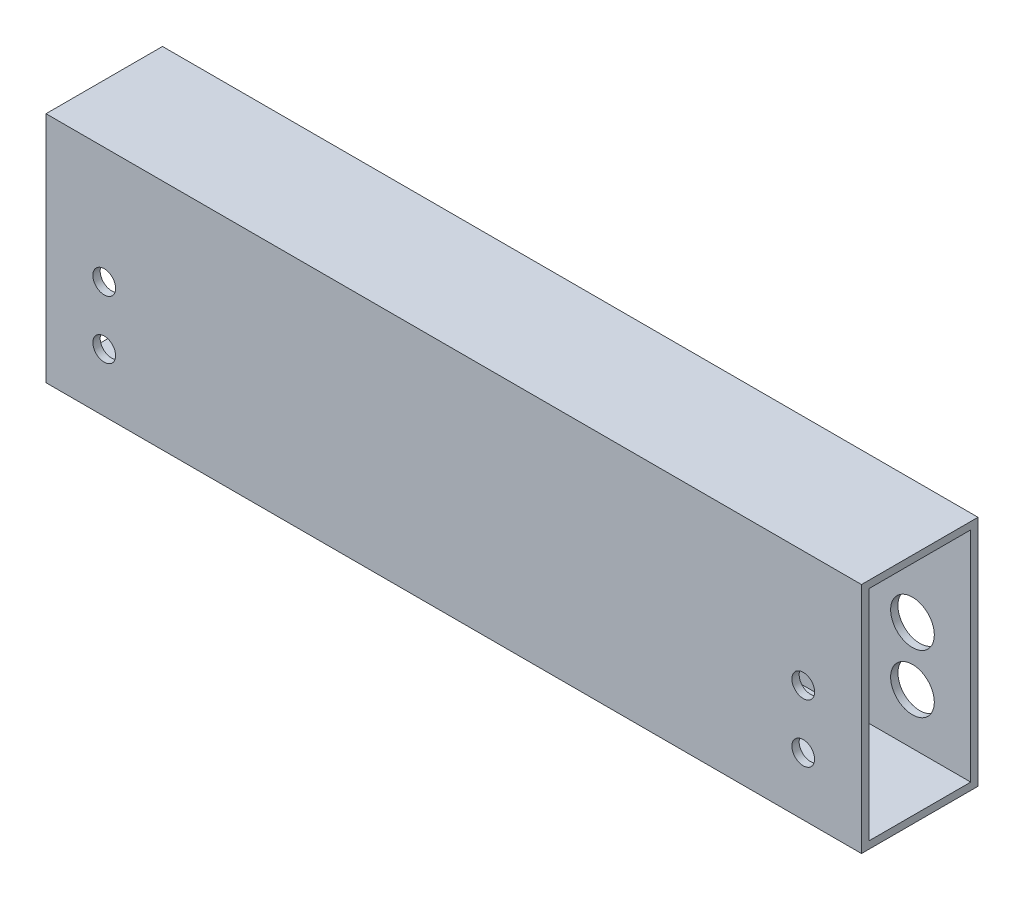
ISO-10303-21;
HEADER;
FILE_DESCRIPTION(('STEP AP214'),'2;1');
FILE_NAME('part.step','',(''),(''),'','','');
FILE_SCHEMA(('AUTOMOTIVE_DESIGN { 1 0 10303 214 1 1 1 1 }'));
ENDSEC;
DATA;
#1=APPLICATION_CONTEXT('core data for automotive mechanical design processes');
#2=APPLICATION_PROTOCOL_DEFINITION('international standard','automotive_design',2000,#1);
#3=PRODUCT_CONTEXT('',#1,'mechanical');
#4=PRODUCT('Part','Part','',(#3));
#5=PRODUCT_RELATED_PRODUCT_CATEGORY('part','',(#4));
#6=PRODUCT_DEFINITION_FORMATION('','',#4);
#7=PRODUCT_DEFINITION_CONTEXT('part definition',#1,'design');
#8=PRODUCT_DEFINITION('design','',#6,#7);
#9=PRODUCT_DEFINITION_SHAPE('','',#8);
#10=(LENGTH_UNIT() NAMED_UNIT(*) SI_UNIT(.MILLI.,.METRE.));
#11=(NAMED_UNIT(*) PLANE_ANGLE_UNIT() SI_UNIT($,.RADIAN.));
#12=(NAMED_UNIT(*) SI_UNIT($,.STERADIAN.) SOLID_ANGLE_UNIT());
#13=UNCERTAINTY_MEASURE_WITH_UNIT(LENGTH_MEASURE(1.E-05),#10,'distance_accuracy_value','');
#14=(GEOMETRIC_REPRESENTATION_CONTEXT(3) GLOBAL_UNCERTAINTY_ASSIGNED_CONTEXT((#13)) GLOBAL_UNIT_ASSIGNED_CONTEXT((#10,
#11,#12)) REPRESENTATION_CONTEXT('',''));
#15=CARTESIAN_POINT('',(0.,0.,0.));
#16=DIRECTION('',(0.,0.,1.));
#17=DIRECTION('',(1.,0.,0.));
#18=AXIS2_PLACEMENT_3D('',#15,#16,#17);
#19=CARTESIAN_POINT('',(177.8,838.2,-130.175));
#20=DIRECTION('',(0.,0.,1.));
#21=DIRECTION('',(1.,0.,0.));
#22=AXIS2_PLACEMENT_3D('',#19,#20,#21);
#23=PLANE('',#22);
#24=CARTESIAN_POINT('',(12.7,850.9,-130.175));
#25=DIRECTION('',(0.,0.,-1.));
#26=DIRECTION('',(-1.,0.,0.));
#27=AXIS2_PLACEMENT_3D('',#24,#25,#26);
#28=CIRCLE('',#27,4.76250000000007);
#29=CARTESIAN_POINT('',(7.93749999999992,850.9,-130.175));
#30=VERTEX_POINT('',#29);
#31=EDGE_CURVE('E191',#30,#30,#28,.T.);
#32=ORIENTED_EDGE('',*,*,#31,.F.);
#33=EDGE_LOOP('',(#32));
#34=FACE_BOUND('',#33,.T.);
#35=CARTESIAN_POINT('',(165.1,863.6,-130.175));
#36=DIRECTION('',(0.,0.,-1.));
#37=DIRECTION('',(-1.,0.,0.));
#38=AXIS2_PLACEMENT_3D('',#35,#36,#37);
#39=CIRCLE('',#38,4.76250000000008);
#40=CARTESIAN_POINT('',(160.3375,863.6,-130.175));
#41=VERTEX_POINT('',#40);
#42=EDGE_CURVE('E192',#41,#41,#39,.T.);
#43=ORIENTED_EDGE('',*,*,#42,.F.);
#44=EDGE_LOOP('',(#43));
#45=FACE_BOUND('',#44,.T.);
#46=CARTESIAN_POINT('',(165.1,850.9,-130.175));
#47=DIRECTION('',(0.,0.,-1.));
#48=DIRECTION('',(-1.,0.,0.));
#49=AXIS2_PLACEMENT_3D('',#46,#47,#48);
#50=CIRCLE('',#49,4.76250000000008);
#51=CARTESIAN_POINT('',(160.3375,850.9,-130.175));
#52=VERTEX_POINT('',#51);
#53=EDGE_CURVE('E178',#52,#52,#50,.T.);
#54=ORIENTED_EDGE('',*,*,#53,.F.);
#55=EDGE_LOOP('',(#54));
#56=FACE_BOUND('',#55,.T.);
#57=CARTESIAN_POINT('',(12.7,863.6,-130.175));
#58=DIRECTION('',(0.,0.,-1.));
#59=DIRECTION('',(-1.,0.,0.));
#60=AXIS2_PLACEMENT_3D('',#57,#58,#59);
#61=CIRCLE('',#60,4.76250000000009);
#62=CARTESIAN_POINT('',(7.93749999999991,863.6,-130.175));
#63=VERTEX_POINT('',#62);
#64=EDGE_CURVE('E195',#63,#63,#61,.T.);
#65=ORIENTED_EDGE('',*,*,#64,.F.);
#66=EDGE_LOOP('',(#65));
#67=FACE_BOUND('',#66,.T.);
#68=DIRECTION('',(0.,1.,0.));
#69=VECTOR('',#68,1.);
#70=CARTESIAN_POINT('',(0.,838.2,-130.175));
#71=LINE('',#70,#69);
#72=CARTESIAN_POINT('',(0.,838.2,-130.175));
#73=VERTEX_POINT('',#72);
#74=CARTESIAN_POINT('',(0.,889.,-130.175));
#75=VERTEX_POINT('',#74);
#76=EDGE_CURVE('E148',#73,#75,#71,.T.);
#77=ORIENTED_EDGE('',*,*,#76,.T.);
#78=DIRECTION('',(-1.,0.,0.));
#79=VECTOR('',#78,1.);
#80=CARTESIAN_POINT('',(177.8,889.,-130.175));
#81=LINE('',#80,#79);
#82=CARTESIAN_POINT('',(177.8,889.,-130.175));
#83=VERTEX_POINT('',#82);
#84=EDGE_CURVE('E11',#83,#75,#81,.T.);
#85=ORIENTED_EDGE('',*,*,#84,.F.);
#86=DIRECTION('',(0.,1.,0.));
#87=VECTOR('',#86,1.);
#88=CARTESIAN_POINT('',(177.8,838.2,-130.175));
#89=LINE('',#88,#87);
#90=CARTESIAN_POINT('',(177.8,838.2,-130.175));
#91=VERTEX_POINT('',#90);
#92=EDGE_CURVE('E137',#91,#83,#89,.T.);
#93=ORIENTED_EDGE('',*,*,#92,.F.);
#94=DIRECTION('',(-1.,0.,0.));
#95=VECTOR('',#94,1.);
#96=CARTESIAN_POINT('',(177.8,838.2,-130.175));
#97=LINE('',#96,#95);
#98=EDGE_CURVE('E147',#91,#73,#97,.T.);
#99=ORIENTED_EDGE('',*,*,#98,.T.);
#100=EDGE_LOOP('',(#77,#85,#93,#99));
#101=FACE_BOUND('',#100,.T.);
#102=ADVANCED_FACE('F37',(#34,#45,#56,#67,#101),#23,.F.);
#103=CARTESIAN_POINT('',(177.8,889.,-130.175));
#104=DIRECTION('',(0.,-1.,0.));
#105=DIRECTION('',(0.,0.,-1.));
#106=AXIS2_PLACEMENT_3D('',#103,#104,#105);
#107=PLANE('',#106);
#108=DIRECTION('',(0.,0.,1.));
#109=VECTOR('',#108,1.);
#110=CARTESIAN_POINT('',(0.,889.,-130.175));
#111=LINE('',#110,#109);
#112=CARTESIAN_POINT('',(0.,889.,-104.775));
#113=VERTEX_POINT('',#112);
#114=EDGE_CURVE('E151',#75,#113,#111,.T.);
#115=ORIENTED_EDGE('',*,*,#114,.T.);
#116=DIRECTION('',(-1.,0.,0.));
#117=VECTOR('',#116,1.);
#118=CARTESIAN_POINT('',(177.8,889.,-104.775));
#119=LINE('',#118,#117);
#120=CARTESIAN_POINT('',(177.8,889.,-104.775));
#121=VERTEX_POINT('',#120);
#122=EDGE_CURVE('E45',#121,#113,#119,.T.);
#123=ORIENTED_EDGE('',*,*,#122,.F.);
#124=DIRECTION('',(0.,0.,1.));
#125=VECTOR('',#124,1.);
#126=CARTESIAN_POINT('',(177.8,889.,-130.175));
#127=LINE('',#126,#125);
#128=EDGE_CURVE('E140',#83,#121,#127,.T.);
#129=ORIENTED_EDGE('',*,*,#128,.F.);
#130=ORIENTED_EDGE('',*,*,#84,.T.);
#131=EDGE_LOOP('',(#115,#123,#129,#130));
#132=FACE_BOUND('',#131,.T.);
#133=ADVANCED_FACE('F225',(#132),#107,.F.);
#134=CARTESIAN_POINT('',(177.8,838.2,-104.775));
#135=DIRECTION('',(0.,0.,-1.));
#136=DIRECTION('',(-1.,0.,0.));
#137=AXIS2_PLACEMENT_3D('',#134,#135,#136);
#138=PLANE('',#137);
#139=CARTESIAN_POINT('',(165.1,850.9,-104.775));
#140=DIRECTION('',(0.,0.,-1.));
#141=DIRECTION('',(-1.,0.,0.));
#142=AXIS2_PLACEMENT_3D('',#139,#140,#141);
#143=CIRCLE('',#142,2.47649999999997);
#144=CARTESIAN_POINT('',(162.6235,850.9,-104.775));
#145=VERTEX_POINT('',#144);
#146=EDGE_CURVE('E314',#145,#145,#143,.F.);
#147=ORIENTED_EDGE('',*,*,#146,.F.);
#148=EDGE_LOOP('',(#147));
#149=FACE_BOUND('',#148,.T.);
#150=CARTESIAN_POINT('',(12.7,863.6,-104.775));
#151=DIRECTION('',(0.,0.,-1.));
#152=DIRECTION('',(-1.,0.,0.));
#153=AXIS2_PLACEMENT_3D('',#150,#151,#152);
#154=CIRCLE('',#153,2.47649999999999);
#155=CARTESIAN_POINT('',(10.2235,863.6,-104.775));
#156=VERTEX_POINT('',#155);
#157=EDGE_CURVE('E311',#156,#156,#154,.F.);
#158=ORIENTED_EDGE('',*,*,#157,.F.);
#159=EDGE_LOOP('',(#158));
#160=FACE_BOUND('',#159,.T.);
#161=CARTESIAN_POINT('',(12.7,850.9,-104.775));
#162=DIRECTION('',(0.,0.,-1.));
#163=DIRECTION('',(-1.,0.,0.));
#164=AXIS2_PLACEMENT_3D('',#161,#162,#163);
#165=CIRCLE('',#164,2.47649999999999);
#166=CARTESIAN_POINT('',(10.2235,850.9,-104.775));
#167=VERTEX_POINT('',#166);
#168=EDGE_CURVE('E309',#167,#167,#165,.F.);
#169=ORIENTED_EDGE('',*,*,#168,.F.);
#170=EDGE_LOOP('',(#169));
#171=FACE_BOUND('',#170,.T.);
#172=CARTESIAN_POINT('',(165.1,863.6,-104.775));
#173=DIRECTION('',(0.,0.,-1.));
#174=DIRECTION('',(-1.,0.,0.));
#175=AXIS2_PLACEMENT_3D('',#172,#173,#174);
#176=CIRCLE('',#175,2.47649999999997);
#177=CARTESIAN_POINT('',(162.6235,863.6,-104.775));
#178=VERTEX_POINT('',#177);
#179=EDGE_CURVE('E167',#178,#178,#176,.F.);
#180=ORIENTED_EDGE('',*,*,#179,.F.);
#181=EDGE_LOOP('',(#180));
#182=FACE_BOUND('',#181,.T.);
#183=DIRECTION('',(0.,-1.,0.));
#184=VECTOR('',#183,1.);
#185=CARTESIAN_POINT('',(0.,838.2,-104.775));
#186=LINE('',#185,#184);
#187=CARTESIAN_POINT('',(0.,838.2,-104.775));
#188=VERTEX_POINT('',#187);
#189=EDGE_CURVE('E153',#113,#188,#186,.T.);
#190=ORIENTED_EDGE('',*,*,#189,.T.);
#191=DIRECTION('',(-1.,0.,0.));
#192=VECTOR('',#191,1.);
#193=CARTESIAN_POINT('',(177.8,838.2,-104.775));
#194=LINE('',#193,#192);
#195=CARTESIAN_POINT('',(177.8,838.2,-104.775));
#196=VERTEX_POINT('',#195);
#197=EDGE_CURVE('E158',#196,#188,#194,.T.);
#198=ORIENTED_EDGE('',*,*,#197,.F.);
#199=DIRECTION('',(0.,-1.,0.));
#200=VECTOR('',#199,1.);
#201=CARTESIAN_POINT('',(177.8,838.2,-104.775));
#202=LINE('',#201,#200);
#203=EDGE_CURVE('E143',#121,#196,#202,.T.);
#204=ORIENTED_EDGE('',*,*,#203,.F.);
#205=ORIENTED_EDGE('',*,*,#122,.T.);
#206=EDGE_LOOP('',(#190,#198,#204,#205));
#207=FACE_BOUND('',#206,.T.);
#208=ADVANCED_FACE('F230',(#149,#160,#171,#182,#207),#138,.F.);
#209=CARTESIAN_POINT('',(177.8,838.2,-130.175));
#210=DIRECTION('',(0.,1.,0.));
#211=DIRECTION('',(0.,0.,1.));
#212=AXIS2_PLACEMENT_3D('',#209,#210,#211);
#213=PLANE('',#212);
#214=DIRECTION('',(0.,0.,-1.));
#215=VECTOR('',#214,1.);
#216=CARTESIAN_POINT('',(0.,838.2,-130.175));
#217=LINE('',#216,#215);
#218=EDGE_CURVE('E141',#188,#73,#217,.T.);
#219=ORIENTED_EDGE('',*,*,#218,.T.);
#220=ORIENTED_EDGE('',*,*,#98,.F.);
#221=DIRECTION('',(0.,0.,-1.));
#222=VECTOR('',#221,1.);
#223=CARTESIAN_POINT('',(177.8,838.2,-130.175));
#224=LINE('',#223,#222);
#225=EDGE_CURVE('E145',#196,#91,#224,.T.);
#226=ORIENTED_EDGE('',*,*,#225,.F.);
#227=ORIENTED_EDGE('',*,*,#197,.T.);
#228=EDGE_LOOP('',(#219,#220,#226,#227));
#229=FACE_BOUND('',#228,.T.);
#230=ADVANCED_FACE('F251',(#229),#213,.F.);
#231=CARTESIAN_POINT('',(177.8,0.,0.));
#232=DIRECTION('',(1.,0.,0.));
#233=DIRECTION('',(0.,0.,-1.));
#234=AXIS2_PLACEMENT_3D('',#231,#232,#233);
#235=PLANE('',#234);
#236=DIRECTION('',(0.,1.,0.));
#237=VECTOR('',#236,1.);
#238=CARTESIAN_POINT('',(177.8,838.2,-128.5875));
#239=LINE('',#238,#237);
#240=CARTESIAN_POINT('',(177.8,839.7875,-128.5875));
#241=VERTEX_POINT('',#240);
#242=CARTESIAN_POINT('',(177.8,887.4125,-128.5875));
#243=VERTEX_POINT('',#242);
#244=EDGE_CURVE('E125',#241,#243,#239,.T.);
#245=ORIENTED_EDGE('',*,*,#244,.F.);
#246=DIRECTION('',(0.,0.,-1.));
#247=VECTOR('',#246,1.);
#248=CARTESIAN_POINT('',(177.8,839.7875,-130.175));
#249=LINE('',#248,#247);
#250=CARTESIAN_POINT('',(177.8,839.7875,-106.3625));
#251=VERTEX_POINT('',#250);
#252=EDGE_CURVE('E108',#251,#241,#249,.T.);
#253=ORIENTED_EDGE('',*,*,#252,.F.);
#254=DIRECTION('',(0.,-1.,0.));
#255=VECTOR('',#254,1.);
#256=CARTESIAN_POINT('',(177.8,838.2,-106.3625));
#257=LINE('',#256,#255);
#258=CARTESIAN_POINT('',(177.8,887.4125,-106.3625));
#259=VERTEX_POINT('',#258);
#260=EDGE_CURVE('E134',#259,#251,#257,.T.);
#261=ORIENTED_EDGE('',*,*,#260,.F.);
#262=DIRECTION('',(0.,0.,1.));
#263=VECTOR('',#262,1.);
#264=CARTESIAN_POINT('',(177.8,887.4125,-130.175));
#265=LINE('',#264,#263);
#266=EDGE_CURVE('E127',#243,#259,#265,.T.);
#267=ORIENTED_EDGE('',*,*,#266,.F.);
#268=EDGE_LOOP('',(#245,#253,#261,#267));
#269=FACE_BOUND('',#268,.T.);
#270=ORIENTED_EDGE('',*,*,#92,.T.);
#271=ORIENTED_EDGE('',*,*,#128,.T.);
#272=ORIENTED_EDGE('',*,*,#203,.T.);
#273=ORIENTED_EDGE('',*,*,#225,.T.);
#274=EDGE_LOOP('',(#270,#271,#272,#273));
#275=FACE_BOUND('',#274,.T.);
#276=ADVANCED_FACE('F210',(#269,#275),#235,.T.);
#277=CARTESIAN_POINT('',(0.,0.,0.));
#278=DIRECTION('',(1.,0.,0.));
#279=DIRECTION('',(0.,0.,-1.));
#280=AXIS2_PLACEMENT_3D('',#277,#278,#279);
#281=PLANE('',#280);
#282=DIRECTION('',(0.,0.,-1.));
#283=VECTOR('',#282,1.);
#284=CARTESIAN_POINT('',(0.,839.7875,-130.175));
#285=LINE('',#284,#283);
#286=CARTESIAN_POINT('',(0.,839.7875,-106.3625));
#287=VERTEX_POINT('',#286);
#288=CARTESIAN_POINT('',(0.,839.7875,-128.5875));
#289=VERTEX_POINT('',#288);
#290=EDGE_CURVE('E106',#287,#289,#285,.T.);
#291=ORIENTED_EDGE('',*,*,#290,.T.);
#292=DIRECTION('',(0.,1.,0.));
#293=VECTOR('',#292,1.);
#294=CARTESIAN_POINT('',(0.,838.2,-128.5875));
#295=LINE('',#294,#293);
#296=CARTESIAN_POINT('',(0.,887.4125,-128.5875));
#297=VERTEX_POINT('',#296);
#298=EDGE_CURVE('E114',#289,#297,#295,.T.);
#299=ORIENTED_EDGE('',*,*,#298,.T.);
#300=DIRECTION('',(0.,0.,1.));
#301=VECTOR('',#300,1.);
#302=CARTESIAN_POINT('',(0.,887.4125,-130.175));
#303=LINE('',#302,#301);
#304=CARTESIAN_POINT('',(0.,887.4125,-106.3625));
#305=VERTEX_POINT('',#304);
#306=EDGE_CURVE('E120',#297,#305,#303,.T.);
#307=ORIENTED_EDGE('',*,*,#306,.T.);
#308=DIRECTION('',(0.,-1.,0.));
#309=VECTOR('',#308,1.);
#310=CARTESIAN_POINT('',(0.,838.2,-106.3625));
#311=LINE('',#310,#309);
#312=EDGE_CURVE('E60',#305,#287,#311,.T.);
#313=ORIENTED_EDGE('',*,*,#312,.T.);
#314=EDGE_LOOP('',(#291,#299,#307,#313));
#315=FACE_BOUND('',#314,.T.);
#316=ORIENTED_EDGE('',*,*,#76,.F.);
#317=ORIENTED_EDGE('',*,*,#218,.F.);
#318=ORIENTED_EDGE('',*,*,#189,.F.);
#319=ORIENTED_EDGE('',*,*,#114,.F.);
#320=EDGE_LOOP('',(#316,#317,#318,#319));
#321=FACE_BOUND('',#320,.T.);
#322=ADVANCED_FACE('F123',(#315,#321),#281,.F.);
#323=CARTESIAN_POINT('',(177.8,838.2,-128.5875));
#324=DIRECTION('',(0.,0.,1.));
#325=DIRECTION('',(1.,0.,0.));
#326=AXIS2_PLACEMENT_3D('',#323,#324,#325);
#327=PLANE('',#326);
#328=CARTESIAN_POINT('',(12.7,850.9,-128.5875));
#329=DIRECTION('',(0.,0.,1.));
#330=DIRECTION('',(1.,0.,0.));
#331=AXIS2_PLACEMENT_3D('',#328,#329,#330);
#332=CIRCLE('',#331,4.76250000000007);
#333=CARTESIAN_POINT('',(17.4625000000001,850.9,-128.5875));
#334=VERTEX_POINT('',#333);
#335=EDGE_CURVE('E188',#334,#334,#332,.F.);
#336=ORIENTED_EDGE('',*,*,#335,.T.);
#337=EDGE_LOOP('',(#336));
#338=FACE_BOUND('',#337,.T.);
#339=CARTESIAN_POINT('',(165.1,863.6,-128.5875));
#340=DIRECTION('',(0.,0.,1.));
#341=DIRECTION('',(1.,0.,0.));
#342=AXIS2_PLACEMENT_3D('',#339,#340,#341);
#343=CIRCLE('',#342,4.76250000000008);
#344=CARTESIAN_POINT('',(169.8625,863.6,-128.5875));
#345=VERTEX_POINT('',#344);
#346=EDGE_CURVE('E183',#345,#345,#343,.F.);
#347=ORIENTED_EDGE('',*,*,#346,.T.);
#348=EDGE_LOOP('',(#347));
#349=FACE_BOUND('',#348,.T.);
#350=CARTESIAN_POINT('',(165.1,850.9,-128.5875));
#351=DIRECTION('',(0.,0.,1.));
#352=DIRECTION('',(1.,0.,0.));
#353=AXIS2_PLACEMENT_3D('',#350,#351,#352);
#354=CIRCLE('',#353,4.76250000000008);
#355=CARTESIAN_POINT('',(169.8625,850.9,-128.5875));
#356=VERTEX_POINT('',#355);
#357=EDGE_CURVE('E174',#356,#356,#354,.F.);
#358=ORIENTED_EDGE('',*,*,#357,.T.);
#359=EDGE_LOOP('',(#358));
#360=FACE_BOUND('',#359,.T.);
#361=CARTESIAN_POINT('',(12.7,863.6,-128.5875));
#362=DIRECTION('',(0.,0.,1.));
#363=DIRECTION('',(1.,0.,0.));
#364=AXIS2_PLACEMENT_3D('',#361,#362,#363);
#365=CIRCLE('',#364,4.76250000000009);
#366=CARTESIAN_POINT('',(17.4625000000001,863.6,-128.5875));
#367=VERTEX_POINT('',#366);
#368=EDGE_CURVE('E121',#367,#367,#365,.F.);
#369=ORIENTED_EDGE('',*,*,#368,.T.);
#370=EDGE_LOOP('',(#369));
#371=FACE_BOUND('',#370,.T.);
#372=ORIENTED_EDGE('',*,*,#298,.F.);
#373=DIRECTION('',(-1.,0.,0.));
#374=VECTOR('',#373,1.);
#375=CARTESIAN_POINT('',(177.8,839.7875,-128.5875));
#376=LINE('',#375,#374);
#377=EDGE_CURVE('E102',#241,#289,#376,.T.);
#378=ORIENTED_EDGE('',*,*,#377,.F.);
#379=ORIENTED_EDGE('',*,*,#244,.T.);
#380=DIRECTION('',(-1.,0.,0.));
#381=VECTOR('',#380,1.);
#382=CARTESIAN_POINT('',(177.8,887.4125,-128.5875));
#383=LINE('',#382,#381);
#384=EDGE_CURVE('E117',#243,#297,#383,.T.);
#385=ORIENTED_EDGE('',*,*,#384,.T.);
#386=EDGE_LOOP('',(#372,#378,#379,#385));
#387=FACE_BOUND('',#386,.T.);
#388=ADVANCED_FACE('F115',(#338,#349,#360,#371,#387),#327,.T.);
#389=CARTESIAN_POINT('',(177.8,887.4125,-130.175));
#390=DIRECTION('',(0.,-1.,0.));
#391=DIRECTION('',(0.,0.,-1.));
#392=AXIS2_PLACEMENT_3D('',#389,#390,#391);
#393=PLANE('',#392);
#394=ORIENTED_EDGE('',*,*,#306,.F.);
#395=ORIENTED_EDGE('',*,*,#384,.F.);
#396=ORIENTED_EDGE('',*,*,#266,.T.);
#397=DIRECTION('',(-1.,0.,0.));
#398=VECTOR('',#397,1.);
#399=CARTESIAN_POINT('',(177.8,887.4125,-106.3625));
#400=LINE('',#399,#398);
#401=EDGE_CURVE('E204',#259,#305,#400,.T.);
#402=ORIENTED_EDGE('',*,*,#401,.T.);
#403=EDGE_LOOP('',(#394,#395,#396,#402));
#404=FACE_BOUND('',#403,.T.);
#405=ADVANCED_FACE('F213',(#404),#393,.T.);
#406=CARTESIAN_POINT('',(177.8,838.2,-106.3625));
#407=DIRECTION('',(0.,0.,-1.));
#408=DIRECTION('',(-1.,0.,0.));
#409=AXIS2_PLACEMENT_3D('',#406,#407,#408);
#410=PLANE('',#409);
#411=CARTESIAN_POINT('',(165.1,850.9,-106.3625));
#412=DIRECTION('',(0.,0.,-1.));
#413=DIRECTION('',(-1.,0.,0.));
#414=AXIS2_PLACEMENT_3D('',#411,#412,#413);
#415=CIRCLE('',#414,2.47649999999997);
#416=CARTESIAN_POINT('',(162.6235,850.9,-106.3625));
#417=VERTEX_POINT('',#416);
#418=EDGE_CURVE('E40',#417,#417,#415,.T.);
#419=ORIENTED_EDGE('',*,*,#418,.F.);
#420=EDGE_LOOP('',(#419));
#421=FACE_BOUND('',#420,.T.);
#422=CARTESIAN_POINT('',(12.7,863.6,-106.3625));
#423=DIRECTION('',(0.,0.,-1.));
#424=DIRECTION('',(-1.,0.,0.));
#425=AXIS2_PLACEMENT_3D('',#422,#423,#424);
#426=CIRCLE('',#425,2.47649999999999);
#427=CARTESIAN_POINT('',(10.2235,863.6,-106.3625));
#428=VERTEX_POINT('',#427);
#429=EDGE_CURVE('E169',#428,#428,#426,.T.);
#430=ORIENTED_EDGE('',*,*,#429,.F.);
#431=EDGE_LOOP('',(#430));
#432=FACE_BOUND('',#431,.T.);
#433=CARTESIAN_POINT('',(12.7,850.9,-106.3625));
#434=DIRECTION('',(0.,0.,-1.));
#435=DIRECTION('',(-1.,0.,0.));
#436=AXIS2_PLACEMENT_3D('',#433,#434,#435);
#437=CIRCLE('',#436,2.47649999999999);
#438=CARTESIAN_POINT('',(10.2235,850.9,-106.3625));
#439=VERTEX_POINT('',#438);
#440=EDGE_CURVE('E166',#439,#439,#437,.T.);
#441=ORIENTED_EDGE('',*,*,#440,.F.);
#442=EDGE_LOOP('',(#441));
#443=FACE_BOUND('',#442,.T.);
#444=CARTESIAN_POINT('',(165.1,863.6,-106.3625));
#445=DIRECTION('',(0.,0.,-1.));
#446=DIRECTION('',(-1.,0.,0.));
#447=AXIS2_PLACEMENT_3D('',#444,#445,#446);
#448=CIRCLE('',#447,2.47649999999997);
#449=CARTESIAN_POINT('',(162.6235,863.6,-106.3625));
#450=VERTEX_POINT('',#449);
#451=EDGE_CURVE('E163',#450,#450,#448,.T.);
#452=ORIENTED_EDGE('',*,*,#451,.F.);
#453=EDGE_LOOP('',(#452));
#454=FACE_BOUND('',#453,.T.);
#455=ORIENTED_EDGE('',*,*,#312,.F.);
#456=ORIENTED_EDGE('',*,*,#401,.F.);
#457=ORIENTED_EDGE('',*,*,#260,.T.);
#458=DIRECTION('',(-1.,0.,0.));
#459=VECTOR('',#458,1.);
#460=CARTESIAN_POINT('',(177.8,839.7875,-106.3625));
#461=LINE('',#460,#459);
#462=EDGE_CURVE('E53',#251,#287,#461,.T.);
#463=ORIENTED_EDGE('',*,*,#462,.T.);
#464=EDGE_LOOP('',(#455,#456,#457,#463));
#465=FACE_BOUND('',#464,.T.);
#466=ADVANCED_FACE('F206',(#421,#432,#443,#454,#465),#410,.T.);
#467=CARTESIAN_POINT('',(177.8,839.7875,-130.175));
#468=DIRECTION('',(0.,1.,0.));
#469=DIRECTION('',(0.,0.,1.));
#470=AXIS2_PLACEMENT_3D('',#467,#468,#469);
#471=PLANE('',#470);
#472=ORIENTED_EDGE('',*,*,#290,.F.);
#473=ORIENTED_EDGE('',*,*,#462,.F.);
#474=ORIENTED_EDGE('',*,*,#252,.T.);
#475=ORIENTED_EDGE('',*,*,#377,.T.);
#476=EDGE_LOOP('',(#472,#473,#474,#475));
#477=FACE_BOUND('',#476,.T.);
#478=ADVANCED_FACE('F104',(#477),#471,.T.);
#479=CARTESIAN_POINT('',(12.7,863.6,-115.117115818396));
#480=DIRECTION('',(0.,0.,-1.));
#481=DIRECTION('',(-1.,0.,0.));
#482=AXIS2_PLACEMENT_3D('',#479,#480,#481);
#483=CYLINDRICAL_SURFACE('',#482,4.76250000000009);
#484=ORIENTED_EDGE('',*,*,#64,.T.);
#485=EDGE_LOOP('',(#484));
#486=FACE_BOUND('',#485,.T.);
#487=ORIENTED_EDGE('',*,*,#368,.F.);
#488=EDGE_LOOP('',(#487));
#489=FACE_BOUND('',#488,.T.);
#490=ADVANCED_FACE('F268',(#486,#489),#483,.F.);
#491=CARTESIAN_POINT('',(165.1,850.9,-115.117115818396));
#492=DIRECTION('',(0.,0.,-1.));
#493=DIRECTION('',(-1.,0.,0.));
#494=AXIS2_PLACEMENT_3D('',#491,#492,#493);
#495=CYLINDRICAL_SURFACE('',#494,4.76250000000008);
#496=ORIENTED_EDGE('',*,*,#53,.T.);
#497=EDGE_LOOP('',(#496));
#498=FACE_BOUND('',#497,.T.);
#499=ORIENTED_EDGE('',*,*,#357,.F.);
#500=EDGE_LOOP('',(#499));
#501=FACE_BOUND('',#500,.T.);
#502=ADVANCED_FACE('F272',(#498,#501),#495,.F.);
#503=CARTESIAN_POINT('',(165.1,863.6,-115.117115818396));
#504=DIRECTION('',(0.,0.,-1.));
#505=DIRECTION('',(-1.,0.,0.));
#506=AXIS2_PLACEMENT_3D('',#503,#504,#505);
#507=CYLINDRICAL_SURFACE('',#506,4.76250000000008);
#508=ORIENTED_EDGE('',*,*,#42,.T.);
#509=EDGE_LOOP('',(#508));
#510=FACE_BOUND('',#509,.T.);
#511=ORIENTED_EDGE('',*,*,#346,.F.);
#512=EDGE_LOOP('',(#511));
#513=FACE_BOUND('',#512,.T.);
#514=ADVANCED_FACE('F278',(#510,#513),#507,.F.);
#515=CARTESIAN_POINT('',(12.7,850.9,-115.117115818396));
#516=DIRECTION('',(0.,0.,-1.));
#517=DIRECTION('',(-1.,0.,0.));
#518=AXIS2_PLACEMENT_3D('',#515,#516,#517);
#519=CYLINDRICAL_SURFACE('',#518,4.76250000000007);
#520=ORIENTED_EDGE('',*,*,#31,.T.);
#521=EDGE_LOOP('',(#520));
#522=FACE_BOUND('',#521,.T.);
#523=ORIENTED_EDGE('',*,*,#335,.F.);
#524=EDGE_LOOP('',(#523));
#525=FACE_BOUND('',#524,.T.);
#526=ADVANCED_FACE('F285',(#522,#525),#519,.F.);
#527=CARTESIAN_POINT('',(165.1,863.6,-97.7704002255661));
#528=DIRECTION('',(0.,0.,-1.));
#529=DIRECTION('',(-1.,0.,0.));
#530=AXIS2_PLACEMENT_3D('',#527,#528,#529);
#531=CYLINDRICAL_SURFACE('',#530,2.47649999999997);
#532=ORIENTED_EDGE('',*,*,#451,.T.);
#533=EDGE_LOOP('',(#532));
#534=FACE_BOUND('',#533,.T.);
#535=ORIENTED_EDGE('',*,*,#179,.T.);
#536=EDGE_LOOP('',(#535));
#537=FACE_BOUND('',#536,.T.);
#538=ADVANCED_FACE('F288',(#534,#537),#531,.F.);
#539=CARTESIAN_POINT('',(12.7,850.9,-97.7704002255661));
#540=DIRECTION('',(0.,0.,-1.));
#541=DIRECTION('',(-1.,0.,0.));
#542=AXIS2_PLACEMENT_3D('',#539,#540,#541);
#543=CYLINDRICAL_SURFACE('',#542,2.47649999999999);
#544=ORIENTED_EDGE('',*,*,#440,.T.);
#545=EDGE_LOOP('',(#544));
#546=FACE_BOUND('',#545,.T.);
#547=ORIENTED_EDGE('',*,*,#168,.T.);
#548=EDGE_LOOP('',(#547));
#549=FACE_BOUND('',#548,.T.);
#550=ADVANCED_FACE('F293',(#546,#549),#543,.F.);
#551=CARTESIAN_POINT('',(12.7,863.6,-97.7704002255661));
#552=DIRECTION('',(0.,0.,-1.));
#553=DIRECTION('',(-1.,0.,0.));
#554=AXIS2_PLACEMENT_3D('',#551,#552,#553);
#555=CYLINDRICAL_SURFACE('',#554,2.47649999999999);
#556=ORIENTED_EDGE('',*,*,#429,.T.);
#557=EDGE_LOOP('',(#556));
#558=FACE_BOUND('',#557,.T.);
#559=ORIENTED_EDGE('',*,*,#157,.T.);
#560=EDGE_LOOP('',(#559));
#561=FACE_BOUND('',#560,.T.);
#562=ADVANCED_FACE('F295',(#558,#561),#555,.F.);
#563=CARTESIAN_POINT('',(165.1,850.9,-97.7704002255661));
#564=DIRECTION('',(0.,0.,-1.));
#565=DIRECTION('',(-1.,0.,0.));
#566=AXIS2_PLACEMENT_3D('',#563,#564,#565);
#567=CYLINDRICAL_SURFACE('',#566,2.47649999999997);
#568=ORIENTED_EDGE('',*,*,#418,.T.);
#569=EDGE_LOOP('',(#568));
#570=FACE_BOUND('',#569,.T.);
#571=ORIENTED_EDGE('',*,*,#146,.T.);
#572=EDGE_LOOP('',(#571));
#573=FACE_BOUND('',#572,.T.);
#574=ADVANCED_FACE('F298',(#570,#573),#567,.F.);
#575=CLOSED_SHELL('',(#102,#133,#208,#230,#276,#322,#388,#405,#466,#478,#490,#502,#514,#526,
#538,#550,#562,#574));
#576=MANIFOLD_SOLID_BREP('B2',#575);
#577=ADVANCED_BREP_SHAPE_REPRESENTATION('',(#18,#576),#14);
#578=SHAPE_DEFINITION_REPRESENTATION(#9,#577);
ENDSEC;
END-ISO-10303-21;
